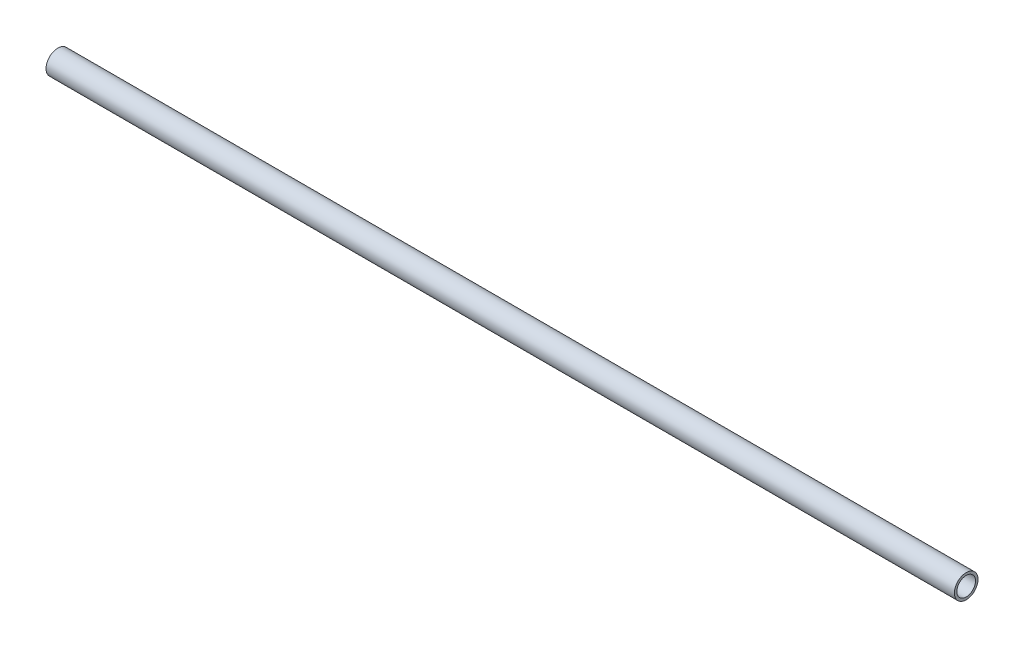
ISO-10303-21;
HEADER;
FILE_DESCRIPTION(('STEP AP214'),'2;1');
FILE_NAME('part.step','',(''),(''),'','','');
FILE_SCHEMA(('AUTOMOTIVE_DESIGN { 1 0 10303 214 1 1 1 1 }'));
ENDSEC;
DATA;
#1=APPLICATION_CONTEXT('core data for automotive mechanical design processes');
#2=APPLICATION_PROTOCOL_DEFINITION('international standard','automotive_design',2000,#1);
#3=PRODUCT_CONTEXT('',#1,'mechanical');
#4=PRODUCT('Part','Part','',(#3));
#5=PRODUCT_RELATED_PRODUCT_CATEGORY('part','',(#4));
#6=PRODUCT_DEFINITION_FORMATION('','',#4);
#7=PRODUCT_DEFINITION_CONTEXT('part definition',#1,'design');
#8=PRODUCT_DEFINITION('design','',#6,#7);
#9=PRODUCT_DEFINITION_SHAPE('','',#8);
#10=(LENGTH_UNIT() NAMED_UNIT(*) SI_UNIT(.MILLI.,.METRE.));
#11=(NAMED_UNIT(*) PLANE_ANGLE_UNIT() SI_UNIT($,.RADIAN.));
#12=(NAMED_UNIT(*) SI_UNIT($,.STERADIAN.) SOLID_ANGLE_UNIT());
#13=UNCERTAINTY_MEASURE_WITH_UNIT(LENGTH_MEASURE(1.E-05),#10,'distance_accuracy_value','');
#14=(GEOMETRIC_REPRESENTATION_CONTEXT(3) GLOBAL_UNCERTAINTY_ASSIGNED_CONTEXT((#13)) GLOBAL_UNIT_ASSIGNED_CONTEXT((#10,
#11,#12)) REPRESENTATION_CONTEXT('',''));
#15=CARTESIAN_POINT('',(0.,0.,0.));
#16=DIRECTION('',(0.,0.,1.));
#17=DIRECTION('',(1.,0.,0.));
#18=AXIS2_PLACEMENT_3D('',#15,#16,#17);
#19=CARTESIAN_POINT('',(1460.,0.,0.));
#20=DIRECTION('',(1.,0.,0.));
#21=DIRECTION('',(0.,0.,-1.));
#22=AXIS2_PLACEMENT_3D('',#19,#20,#21);
#23=PLANE('',#22);
#24=CARTESIAN_POINT('',(1460.,0.,0.));
#25=DIRECTION('',(1.,0.,0.));
#26=DIRECTION('',(0.,0.,-1.));
#27=AXIS2_PLACEMENT_3D('',#24,#25,#26);
#28=CIRCLE('',#27,19.);
#29=CARTESIAN_POINT('',(1460.,0.,19.));
#30=VERTEX_POINT('',#29);
#31=EDGE_CURVE('E10',#30,#30,#28,.T.);
#32=ORIENTED_EDGE('',*,*,#31,.T.);
#33=EDGE_LOOP('',(#32));
#34=FACE_BOUND('',#33,.T.);
#35=CARTESIAN_POINT('',(1460.,0.,0.));
#36=DIRECTION('',(1.,0.,0.));
#37=DIRECTION('',(0.,0.,-1.));
#38=AXIS2_PLACEMENT_3D('',#35,#36,#37);
#39=CIRCLE('',#38,15.);
#40=CARTESIAN_POINT('',(1460.,0.,15.));
#41=VERTEX_POINT('',#40);
#42=EDGE_CURVE('E42',#41,#41,#39,.T.);
#43=ORIENTED_EDGE('',*,*,#42,.F.);
#44=EDGE_LOOP('',(#43));
#45=FACE_BOUND('',#44,.T.);
#46=ADVANCED_FACE('F31',(#34,#45),#23,.T.);
#47=CARTESIAN_POINT('',(0.,0.,0.));
#48=DIRECTION('',(1.,0.,0.));
#49=DIRECTION('',(0.,0.,-1.));
#50=AXIS2_PLACEMENT_3D('',#47,#48,#49);
#51=PLANE('',#50);
#52=CARTESIAN_POINT('',(0.,0.,0.));
#53=DIRECTION('',(1.,0.,0.));
#54=DIRECTION('',(0.,0.,-1.));
#55=AXIS2_PLACEMENT_3D('',#52,#53,#54);
#56=CIRCLE('',#55,19.);
#57=CARTESIAN_POINT('',(-2.22044604925031E-13,0.,19.));
#58=VERTEX_POINT('',#57);
#59=EDGE_CURVE('E35',#58,#58,#56,.T.);
#60=ORIENTED_EDGE('',*,*,#59,.F.);
#61=EDGE_LOOP('',(#60));
#62=FACE_BOUND('',#61,.T.);
#63=CARTESIAN_POINT('',(0.,0.,0.));
#64=DIRECTION('',(1.,0.,0.));
#65=DIRECTION('',(0.,0.,-1.));
#66=AXIS2_PLACEMENT_3D('',#63,#64,#65);
#67=CIRCLE('',#66,15.);
#68=CARTESIAN_POINT('',(-2.22044604925031E-13,0.,15.));
#69=VERTEX_POINT('',#68);
#70=EDGE_CURVE('E44',#69,#69,#67,.T.);
#71=ORIENTED_EDGE('',*,*,#70,.T.);
#72=EDGE_LOOP('',(#71));
#73=FACE_BOUND('',#72,.T.);
#74=ADVANCED_FACE('F54',(#62,#73),#51,.F.);
#75=CARTESIAN_POINT('',(1460.,0.,0.));
#76=DIRECTION('',(-1.,0.,0.));
#77=DIRECTION('',(0.,0.,1.));
#78=AXIS2_PLACEMENT_3D('',#75,#76,#77);
#79=CYLINDRICAL_SURFACE('',#78,19.);
#80=CARTESIAN_POINT('',(1460.,0.,19.));
#81=CARTESIAN_POINT('',(1444.79166666667,0.,19.));
#82=CARTESIAN_POINT('',(1429.58333333333,0.,19.));
#83=CARTESIAN_POINT('',(1399.16666666667,0.,19.));
#84=CARTESIAN_POINT('',(1383.95833333333,0.,19.));
#85=CARTESIAN_POINT('',(1353.54166666667,0.,19.));
#86=CARTESIAN_POINT('',(1338.33333333333,0.,19.));
#87=CARTESIAN_POINT('',(1307.91666666667,0.,19.));
#88=CARTESIAN_POINT('',(1292.70833333333,0.,19.));
#89=CARTESIAN_POINT('',(1262.29166666667,0.,19.));
#90=CARTESIAN_POINT('',(1247.08333333333,0.,19.));
#91=CARTESIAN_POINT('',(1216.66666666667,0.,19.));
#92=CARTESIAN_POINT('',(1201.45833333333,0.,19.));
#93=CARTESIAN_POINT('',(1171.04166666667,0.,19.));
#94=CARTESIAN_POINT('',(1155.83333333333,0.,19.));
#95=CARTESIAN_POINT('',(1125.41666666667,0.,19.));
#96=CARTESIAN_POINT('',(1110.20833333333,0.,19.));
#97=CARTESIAN_POINT('',(1079.79166666667,0.,19.));
#98=CARTESIAN_POINT('',(1064.58333333333,0.,19.));
#99=CARTESIAN_POINT('',(1034.16666666667,0.,19.));
#100=CARTESIAN_POINT('',(1018.95833333333,0.,19.));
#101=CARTESIAN_POINT('',(988.541666666667,0.,19.));
#102=CARTESIAN_POINT('',(973.333333333333,0.,19.));
#103=CARTESIAN_POINT('',(942.916666666667,0.,19.));
#104=CARTESIAN_POINT('',(927.708333333333,0.,19.));
#105=CARTESIAN_POINT('',(897.291666666667,0.,19.));
#106=CARTESIAN_POINT('',(882.083333333333,0.,19.));
#107=CARTESIAN_POINT('',(851.666666666667,0.,19.));
#108=CARTESIAN_POINT('',(836.458333333333,0.,19.));
#109=CARTESIAN_POINT('',(806.041666666667,0.,19.));
#110=CARTESIAN_POINT('',(790.833333333333,0.,19.));
#111=CARTESIAN_POINT('',(760.416666666667,0.,19.));
#112=CARTESIAN_POINT('',(745.208333333333,0.,19.));
#113=CARTESIAN_POINT('',(714.791666666667,0.,19.));
#114=CARTESIAN_POINT('',(699.583333333333,0.,19.));
#115=CARTESIAN_POINT('',(669.166666666667,0.,19.));
#116=CARTESIAN_POINT('',(653.958333333333,0.,19.));
#117=CARTESIAN_POINT('',(623.541666666667,0.,19.));
#118=CARTESIAN_POINT('',(608.333333333333,0.,19.));
#119=CARTESIAN_POINT('',(577.916666666667,0.,19.));
#120=CARTESIAN_POINT('',(562.708333333333,0.,19.));
#121=CARTESIAN_POINT('',(532.291666666667,0.,19.));
#122=CARTESIAN_POINT('',(517.083333333333,0.,19.));
#123=CARTESIAN_POINT('',(486.666666666667,0.,19.));
#124=CARTESIAN_POINT('',(471.458333333333,0.,19.));
#125=CARTESIAN_POINT('',(441.041666666667,0.,19.));
#126=CARTESIAN_POINT('',(425.833333333333,0.,19.));
#127=CARTESIAN_POINT('',(395.416666666666,0.,19.));
#128=CARTESIAN_POINT('',(380.208333333333,0.,19.));
#129=CARTESIAN_POINT('',(349.791666666666,0.,19.));
#130=CARTESIAN_POINT('',(334.583333333333,0.,19.));
#131=CARTESIAN_POINT('',(304.166666666666,0.,19.));
#132=CARTESIAN_POINT('',(288.958333333333,0.,19.));
#133=CARTESIAN_POINT('',(258.541666666666,0.,19.));
#134=CARTESIAN_POINT('',(243.333333333333,0.,19.));
#135=CARTESIAN_POINT('',(212.916666666667,0.,19.));
#136=CARTESIAN_POINT('',(197.708333333333,0.,19.));
#137=CARTESIAN_POINT('',(167.291666666667,0.,19.));
#138=CARTESIAN_POINT('',(152.083333333333,0.,19.));
#139=CARTESIAN_POINT('',(121.666666666667,0.,19.));
#140=CARTESIAN_POINT('',(106.458333333333,0.,19.));
#141=CARTESIAN_POINT('',(76.0416666666665,0.,19.));
#142=CARTESIAN_POINT('',(60.8333333333332,0.,19.));
#143=CARTESIAN_POINT('',(30.4166666666665,0.,19.));
#144=CARTESIAN_POINT('',(15.2083333333331,0.,19.));
#145=CARTESIAN_POINT('',(-2.22044604925031E-13,0.,19.));
#146=B_SPLINE_CURVE_WITH_KNOTS('',3,(#80,#81,#82,#83,#84,#85,#86,#87,#88,#89,#90,#91,#92,#93,
#94,#95,#96,#97,#98,#99,#100,#101,#102,#103,#104,#105,#106,#107,#108,#109,#110,#111,#112,#113,
#114,#115,#116,#117,#118,#119,#120,#121,#122,#123,#124,#125,#126,#127,#128,#129,#130,#131,#132,
#133,#134,#135,#136,#137,#138,#139,#140,#141,#142,#143,#144,#145),.UNSPECIFIED.,.F.,.F.,(4,2,2,
2,2,2,2,2,2,2,2,2,2,2,2,2,2,2,2,2,2,2,2,2,2,2,2,2,2,2,2,2,4),(0.,45.6249999999998,
91.2499999999998,136.875,182.5,228.125,273.75,319.375,365.,410.625,456.25,501.875,547.5,593.125,
638.75,684.375,730.,775.625,821.25,866.875,912.5,958.125,1003.75,1049.375,1095.,1140.625,
1186.25,1231.875,1277.5,1323.125,1368.75,1414.375,1460.),.UNSPECIFIED.);
#147=EDGE_CURVE('BSEAM33',#30,#58,#146,.T.);
#148=ORIENTED_EDGE('',*,*,#31,.F.);
#149=ORIENTED_EDGE('',*,*,#59,.T.);
#150=ORIENTED_EDGE('',*,*,#147,.T.);
#151=ORIENTED_EDGE('',*,*,#147,.F.);
#152=EDGE_LOOP('',(#148,#150,#149,#151));
#153=FACE_BOUND('',#152,.T.);
#154=ADVANCED_FACE('F33',(#153),#79,.T.);
#155=CARTESIAN_POINT('',(1460.,0.,0.));
#156=DIRECTION('',(-1.,0.,0.));
#157=DIRECTION('',(0.,0.,1.));
#158=AXIS2_PLACEMENT_3D('',#155,#156,#157);
#159=CYLINDRICAL_SURFACE('',#158,15.);
#160=CARTESIAN_POINT('',(1460.,0.,15.));
#161=CARTESIAN_POINT('',(1444.79166666667,0.,15.));
#162=CARTESIAN_POINT('',(1429.58333333333,0.,15.));
#163=CARTESIAN_POINT('',(1399.16666666667,0.,15.));
#164=CARTESIAN_POINT('',(1383.95833333333,0.,15.));
#165=CARTESIAN_POINT('',(1353.54166666667,0.,15.));
#166=CARTESIAN_POINT('',(1338.33333333333,0.,15.));
#167=CARTESIAN_POINT('',(1307.91666666667,0.,15.));
#168=CARTESIAN_POINT('',(1292.70833333333,0.,15.));
#169=CARTESIAN_POINT('',(1262.29166666667,0.,15.));
#170=CARTESIAN_POINT('',(1247.08333333333,0.,15.));
#171=CARTESIAN_POINT('',(1216.66666666667,0.,15.));
#172=CARTESIAN_POINT('',(1201.45833333333,0.,15.));
#173=CARTESIAN_POINT('',(1171.04166666667,0.,15.));
#174=CARTESIAN_POINT('',(1155.83333333333,0.,15.));
#175=CARTESIAN_POINT('',(1125.41666666667,0.,15.));
#176=CARTESIAN_POINT('',(1110.20833333333,0.,15.));
#177=CARTESIAN_POINT('',(1079.79166666667,0.,15.));
#178=CARTESIAN_POINT('',(1064.58333333333,0.,15.));
#179=CARTESIAN_POINT('',(1034.16666666667,0.,15.));
#180=CARTESIAN_POINT('',(1018.95833333333,0.,15.));
#181=CARTESIAN_POINT('',(988.541666666667,0.,15.));
#182=CARTESIAN_POINT('',(973.333333333333,0.,15.));
#183=CARTESIAN_POINT('',(942.916666666667,0.,15.));
#184=CARTESIAN_POINT('',(927.708333333333,0.,15.));
#185=CARTESIAN_POINT('',(897.291666666667,0.,15.));
#186=CARTESIAN_POINT('',(882.083333333333,0.,15.));
#187=CARTESIAN_POINT('',(851.666666666667,0.,15.));
#188=CARTESIAN_POINT('',(836.458333333333,0.,15.));
#189=CARTESIAN_POINT('',(806.041666666667,0.,15.));
#190=CARTESIAN_POINT('',(790.833333333333,0.,15.));
#191=CARTESIAN_POINT('',(760.416666666667,0.,15.));
#192=CARTESIAN_POINT('',(745.208333333333,0.,15.));
#193=CARTESIAN_POINT('',(714.791666666667,0.,15.));
#194=CARTESIAN_POINT('',(699.583333333333,0.,15.));
#195=CARTESIAN_POINT('',(669.166666666667,0.,15.));
#196=CARTESIAN_POINT('',(653.958333333333,0.,15.));
#197=CARTESIAN_POINT('',(623.541666666667,0.,15.));
#198=CARTESIAN_POINT('',(608.333333333333,0.,15.));
#199=CARTESIAN_POINT('',(577.916666666667,0.,15.));
#200=CARTESIAN_POINT('',(562.708333333333,0.,15.));
#201=CARTESIAN_POINT('',(532.291666666667,0.,15.));
#202=CARTESIAN_POINT('',(517.083333333333,0.,15.));
#203=CARTESIAN_POINT('',(486.666666666667,0.,15.));
#204=CARTESIAN_POINT('',(471.458333333333,0.,15.));
#205=CARTESIAN_POINT('',(441.041666666667,0.,15.));
#206=CARTESIAN_POINT('',(425.833333333333,0.,15.));
#207=CARTESIAN_POINT('',(395.416666666666,0.,15.));
#208=CARTESIAN_POINT('',(380.208333333333,0.,15.));
#209=CARTESIAN_POINT('',(349.791666666666,0.,15.));
#210=CARTESIAN_POINT('',(334.583333333333,0.,15.));
#211=CARTESIAN_POINT('',(304.166666666666,0.,15.));
#212=CARTESIAN_POINT('',(288.958333333333,0.,15.));
#213=CARTESIAN_POINT('',(258.541666666666,0.,15.));
#214=CARTESIAN_POINT('',(243.333333333333,0.,15.));
#215=CARTESIAN_POINT('',(212.916666666667,0.,15.));
#216=CARTESIAN_POINT('',(197.708333333333,0.,15.));
#217=CARTESIAN_POINT('',(167.291666666667,0.,15.));
#218=CARTESIAN_POINT('',(152.083333333333,0.,15.));
#219=CARTESIAN_POINT('',(121.666666666667,0.,15.));
#220=CARTESIAN_POINT('',(106.458333333333,0.,15.));
#221=CARTESIAN_POINT('',(76.0416666666665,0.,15.));
#222=CARTESIAN_POINT('',(60.8333333333332,0.,15.));
#223=CARTESIAN_POINT('',(30.4166666666665,0.,15.));
#224=CARTESIAN_POINT('',(15.2083333333331,0.,15.));
#225=CARTESIAN_POINT('',(-2.22044604925031E-13,0.,15.));
#226=B_SPLINE_CURVE_WITH_KNOTS('',3,(#160,#161,#162,#163,#164,#165,#166,#167,#168,#169,#170,
#171,#172,#173,#174,#175,#176,#177,#178,#179,#180,#181,#182,#183,#184,#185,#186,#187,#188,#189,
#190,#191,#192,#193,#194,#195,#196,#197,#198,#199,#200,#201,#202,#203,#204,#205,#206,#207,#208,
#209,#210,#211,#212,#213,#214,#215,#216,#217,#218,#219,#220,#221,#222,#223,#224,#225),
.UNSPECIFIED.,.F.,.F.,(4,2,2,2,2,2,2,2,2,2,2,2,2,2,2,2,2,2,2,2,2,2,2,2,2,2,2,2,2,2,2,2,4),(0.,
45.6249999999998,91.2499999999998,136.875,182.5,228.125,273.75,319.375,365.,410.625,456.25,
501.875,547.5,593.125,638.75,684.375,730.,775.625,821.25,866.875,912.5,958.125,1003.75,1049.375,
1095.,1140.625,1186.25,1231.875,1277.5,1323.125,1368.75,1414.375,1460.),.UNSPECIFIED.);
#227=EDGE_CURVE('BSEAM50',#41,#69,#226,.T.);
#228=ORIENTED_EDGE('',*,*,#42,.T.);
#229=ORIENTED_EDGE('',*,*,#70,.F.);
#230=ORIENTED_EDGE('',*,*,#227,.T.);
#231=ORIENTED_EDGE('',*,*,#227,.F.);
#232=EDGE_LOOP('',(#228,#230,#229,#231));
#233=FACE_BOUND('',#232,.T.);
#234=ADVANCED_FACE('F50',(#233),#159,.F.);
#235=CLOSED_SHELL('',(#46,#74,#154,#234));
#236=MANIFOLD_SOLID_BREP('B2',#235);
#237=ADVANCED_BREP_SHAPE_REPRESENTATION('',(#18,#236),#14);
#238=SHAPE_DEFINITION_REPRESENTATION(#9,#237);
ENDSEC;
END-ISO-10303-21;
